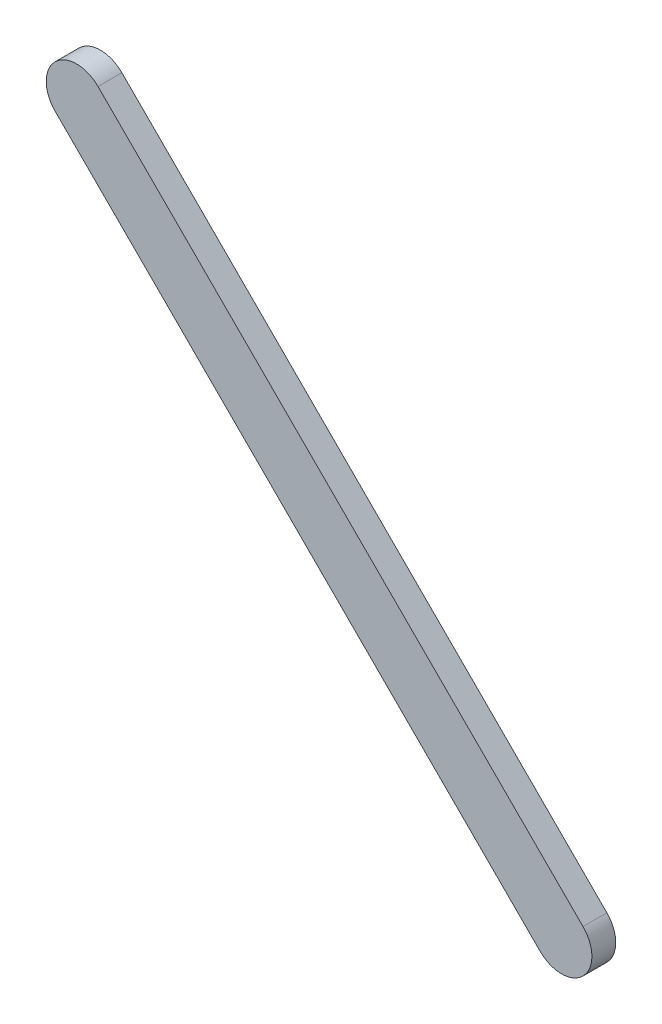
ISO-10303-21;
HEADER;
FILE_DESCRIPTION(('STEP AP214'),'2;1');
FILE_NAME('part.step','',(''),(''),'','','');
FILE_SCHEMA(('AUTOMOTIVE_DESIGN { 1 0 10303 214 1 1 1 1 }'));
ENDSEC;
DATA;
#1=APPLICATION_CONTEXT('core data for automotive mechanical design processes');
#2=APPLICATION_PROTOCOL_DEFINITION('international standard','automotive_design',2000,#1);
#3=PRODUCT_CONTEXT('',#1,'mechanical');
#4=PRODUCT('Part','Part','',(#3));
#5=PRODUCT_RELATED_PRODUCT_CATEGORY('part','',(#4));
#6=PRODUCT_DEFINITION_FORMATION('','',#4);
#7=PRODUCT_DEFINITION_CONTEXT('part definition',#1,'design');
#8=PRODUCT_DEFINITION('design','',#6,#7);
#9=PRODUCT_DEFINITION_SHAPE('','',#8);
#10=(LENGTH_UNIT() NAMED_UNIT(*) SI_UNIT(.MILLI.,.METRE.));
#11=(NAMED_UNIT(*) PLANE_ANGLE_UNIT() SI_UNIT($,.RADIAN.));
#12=(NAMED_UNIT(*) SI_UNIT($,.STERADIAN.) SOLID_ANGLE_UNIT());
#13=UNCERTAINTY_MEASURE_WITH_UNIT(LENGTH_MEASURE(1.E-05),#10,'distance_accuracy_value','');
#14=(GEOMETRIC_REPRESENTATION_CONTEXT(3) GLOBAL_UNCERTAINTY_ASSIGNED_CONTEXT((#13)) GLOBAL_UNIT_ASSIGNED_CONTEXT((#10,
#11,#12)) REPRESENTATION_CONTEXT('',''));
#15=CARTESIAN_POINT('',(0.,0.,0.));
#16=DIRECTION('',(0.,0.,1.));
#17=DIRECTION('',(1.,0.,0.));
#18=AXIS2_PLACEMENT_3D('',#15,#16,#17);
#19=CARTESIAN_POINT('',(152.22039406,121.99439406,0.));
#20=DIRECTION('',(0.707106781186549,0.707106781186546,0.));
#21=DIRECTION('',(0.707106781186546,-0.707106781186549,0.));
#22=AXIS2_PLACEMENT_3D('',#19,#20,#21);
#23=PLANE('',#22);
#24=DIRECTION('',(0.707106781186546,-0.707106781186549,0.));
#25=VECTOR('',#24,1.);
#26=CARTESIAN_POINT('',(152.22039406,121.99439406,0.1999996));
#27=LINE('',#26,#25);
#28=CARTESIAN_POINT('',(152.22039406,121.99439406,0.1999996));
#29=VERTEX_POINT('',#28);
#30=CARTESIAN_POINT('',(156.28439406,117.93039406,0.1999996));
#31=VERTEX_POINT('',#30);
#32=EDGE_CURVE('E11',#29,#31,#27,.T.);
#33=ORIENTED_EDGE('',*,*,#32,.F.);
#34=DIRECTION('',(0.,0.,1.));
#35=VECTOR('',#34,1.);
#36=CARTESIAN_POINT('',(152.22039406,121.99439406,0.));
#37=LINE('',#36,#35);
#38=CARTESIAN_POINT('',(152.22039406,121.99439406,0.));
#39=VERTEX_POINT('',#38);
#40=EDGE_CURVE('E24',#39,#29,#37,.T.);
#41=ORIENTED_EDGE('',*,*,#40,.F.);
#42=DIRECTION('',(0.707106781186546,-0.707106781186549,0.));
#43=VECTOR('',#42,1.);
#44=CARTESIAN_POINT('',(152.22039406,121.99439406,0.));
#45=LINE('',#44,#43);
#46=CARTESIAN_POINT('',(156.28439406,117.93039406,0.));
#47=VERTEX_POINT('',#46);
#48=EDGE_CURVE('E75',#39,#47,#45,.T.);
#49=ORIENTED_EDGE('',*,*,#48,.T.);
#50=DIRECTION('',(0.,0.,1.));
#51=VECTOR('',#50,1.);
#52=CARTESIAN_POINT('',(156.28439406,117.93039406,0.));
#53=LINE('',#52,#51);
#54=EDGE_CURVE('E37',#47,#31,#53,.T.);
#55=ORIENTED_EDGE('',*,*,#54,.T.);
#56=EDGE_LOOP('',(#33,#41,#49,#55));
#57=FACE_BOUND('',#56,.T.);
#58=ADVANCED_FACE('F17',(#57),#23,.F.);
#59=CARTESIAN_POINT('',(156.464,118.11,0.));
#60=DIRECTION('',(0.,0.,-1.));
#61=DIRECTION('',(-0.707106781186576,-0.70710678118652,0.));
#62=AXIS2_PLACEMENT_3D('',#59,#60,#61);
#63=CYLINDRICAL_SURFACE('',#62,0.254001156230768);
#64=CARTESIAN_POINT('',(156.464,118.11,0.1999996));
#65=DIRECTION('',(0.,0.,1.));
#66=DIRECTION('',(-0.707106781186576,-0.70710678118652,0.));
#67=AXIS2_PLACEMENT_3D('',#64,#65,#66);
#68=CIRCLE('',#67,0.254001156230768);
#69=CARTESIAN_POINT('',(156.64360594,118.28960594,0.1999996));
#70=VERTEX_POINT('',#69);
#71=EDGE_CURVE('E83',#31,#70,#68,.T.);
#72=ORIENTED_EDGE('',*,*,#71,.F.);
#73=ORIENTED_EDGE('',*,*,#54,.F.);
#74=CARTESIAN_POINT('',(156.464,118.11,0.));
#75=DIRECTION('',(0.,0.,1.));
#76=DIRECTION('',(-0.707106781186576,-0.70710678118652,0.));
#77=AXIS2_PLACEMENT_3D('',#74,#75,#76);
#78=CIRCLE('',#77,0.254001156230768);
#79=CARTESIAN_POINT('',(156.64360594,118.28960594,0.));
#80=VERTEX_POINT('',#79);
#81=EDGE_CURVE('E81',#47,#80,#78,.T.);
#82=ORIENTED_EDGE('',*,*,#81,.T.);
#83=DIRECTION('',(0.,0.,1.));
#84=VECTOR('',#83,1.);
#85=CARTESIAN_POINT('',(156.64360594,118.28960594,0.));
#86=LINE('',#85,#84);
#87=EDGE_CURVE('E67',#80,#70,#86,.T.);
#88=ORIENTED_EDGE('',*,*,#87,.T.);
#89=EDGE_LOOP('',(#72,#73,#82,#88));
#90=FACE_BOUND('',#89,.T.);
#91=ADVANCED_FACE('F89',(#90),#63,.T.);
#92=CARTESIAN_POINT('',(156.64360594,118.28960594,0.));
#93=DIRECTION('',(-0.707106781186549,-0.707106781186546,0.));
#94=DIRECTION('',(-0.707106781186546,0.707106781186549,0.));
#95=AXIS2_PLACEMENT_3D('',#92,#93,#94);
#96=PLANE('',#95);
#97=DIRECTION('',(-0.707106781186546,0.707106781186549,0.));
#98=VECTOR('',#97,1.);
#99=CARTESIAN_POINT('',(156.64360594,118.28960594,0.1999996));
#100=LINE('',#99,#98);
#101=CARTESIAN_POINT('',(152.57960594,122.35360594,0.1999996));
#102=VERTEX_POINT('',#101);
#103=EDGE_CURVE('E71',#70,#102,#100,.T.);
#104=ORIENTED_EDGE('',*,*,#103,.F.);
#105=ORIENTED_EDGE('',*,*,#87,.F.);
#106=DIRECTION('',(-0.707106781186546,0.707106781186549,0.));
#107=VECTOR('',#106,1.);
#108=CARTESIAN_POINT('',(156.64360594,118.28960594,0.));
#109=LINE('',#108,#107);
#110=CARTESIAN_POINT('',(152.57960594,122.35360594,0.));
#111=VERTEX_POINT('',#110);
#112=EDGE_CURVE('E63',#80,#111,#109,.T.);
#113=ORIENTED_EDGE('',*,*,#112,.T.);
#114=DIRECTION('',(0.,0.,1.));
#115=VECTOR('',#114,1.);
#116=CARTESIAN_POINT('',(152.57960594,122.35360594,0.));
#117=LINE('',#116,#115);
#118=EDGE_CURVE('E53',#111,#102,#117,.T.);
#119=ORIENTED_EDGE('',*,*,#118,.T.);
#120=EDGE_LOOP('',(#104,#105,#113,#119));
#121=FACE_BOUND('',#120,.T.);
#122=ADVANCED_FACE('F66',(#121),#96,.F.);
#123=CARTESIAN_POINT('',(152.4,122.174,0.));
#124=DIRECTION('',(0.,0.,-1.));
#125=DIRECTION('',(0.707106781186576,0.70710678118652,0.));
#126=AXIS2_PLACEMENT_3D('',#123,#124,#125);
#127=CYLINDRICAL_SURFACE('',#126,0.254001156230768);
#128=CARTESIAN_POINT('',(152.4,122.174,0.1999996));
#129=DIRECTION('',(0.,0.,1.));
#130=DIRECTION('',(0.707106781186576,0.70710678118652,0.));
#131=AXIS2_PLACEMENT_3D('',#128,#129,#130);
#132=CIRCLE('',#131,0.254001156230768);
#133=EDGE_CURVE('E59',#102,#29,#132,.T.);
#134=ORIENTED_EDGE('',*,*,#133,.F.);
#135=ORIENTED_EDGE('',*,*,#118,.F.);
#136=CARTESIAN_POINT('',(152.4,122.174,0.));
#137=DIRECTION('',(0.,0.,1.));
#138=DIRECTION('',(0.707106781186576,0.70710678118652,0.));
#139=AXIS2_PLACEMENT_3D('',#136,#137,#138);
#140=CIRCLE('',#139,0.254001156230768);
#141=EDGE_CURVE('E57',#111,#39,#140,.T.);
#142=ORIENTED_EDGE('',*,*,#141,.T.);
#143=ORIENTED_EDGE('',*,*,#40,.T.);
#144=EDGE_LOOP('',(#134,#135,#142,#143));
#145=FACE_BOUND('',#144,.T.);
#146=ADVANCED_FACE('F55',(#145),#127,.T.);
#147=CARTESIAN_POINT('',(152.22039406,121.99439406,0.));
#148=DIRECTION('',(0.,0.,-1.));
#149=DIRECTION('',(-1.,0.,0.));
#150=AXIS2_PLACEMENT_3D('',#147,#148,#149);
#151=PLANE('',#150);
#152=ORIENTED_EDGE('',*,*,#141,.F.);
#153=ORIENTED_EDGE('',*,*,#112,.F.);
#154=ORIENTED_EDGE('',*,*,#81,.F.);
#155=ORIENTED_EDGE('',*,*,#48,.F.);
#156=EDGE_LOOP('',(#152,#153,#154,#155));
#157=FACE_BOUND('',#156,.T.);
#158=ADVANCED_FACE('F74',(#157),#151,.T.);
#159=CARTESIAN_POINT('',(152.22039406,121.99439406,0.1999996));
#160=DIRECTION('',(0.,0.,-1.));
#161=DIRECTION('',(-1.,0.,0.));
#162=AXIS2_PLACEMENT_3D('',#159,#160,#161);
#163=PLANE('',#162);
#164=ORIENTED_EDGE('',*,*,#32,.T.);
#165=ORIENTED_EDGE('',*,*,#71,.T.);
#166=ORIENTED_EDGE('',*,*,#103,.T.);
#167=ORIENTED_EDGE('',*,*,#133,.T.);
#168=EDGE_LOOP('',(#164,#165,#166,#167));
#169=FACE_BOUND('',#168,.T.);
#170=ADVANCED_FACE('F91',(#169),#163,.F.);
#171=CLOSED_SHELL('',(#58,#91,#122,#146,#158,#170));
#172=MANIFOLD_SOLID_BREP('B1',#171);
#173=ADVANCED_BREP_SHAPE_REPRESENTATION('',(#18,#172),#14);
#174=SHAPE_DEFINITION_REPRESENTATION(#9,#173);
ENDSEC;
END-ISO-10303-21;
